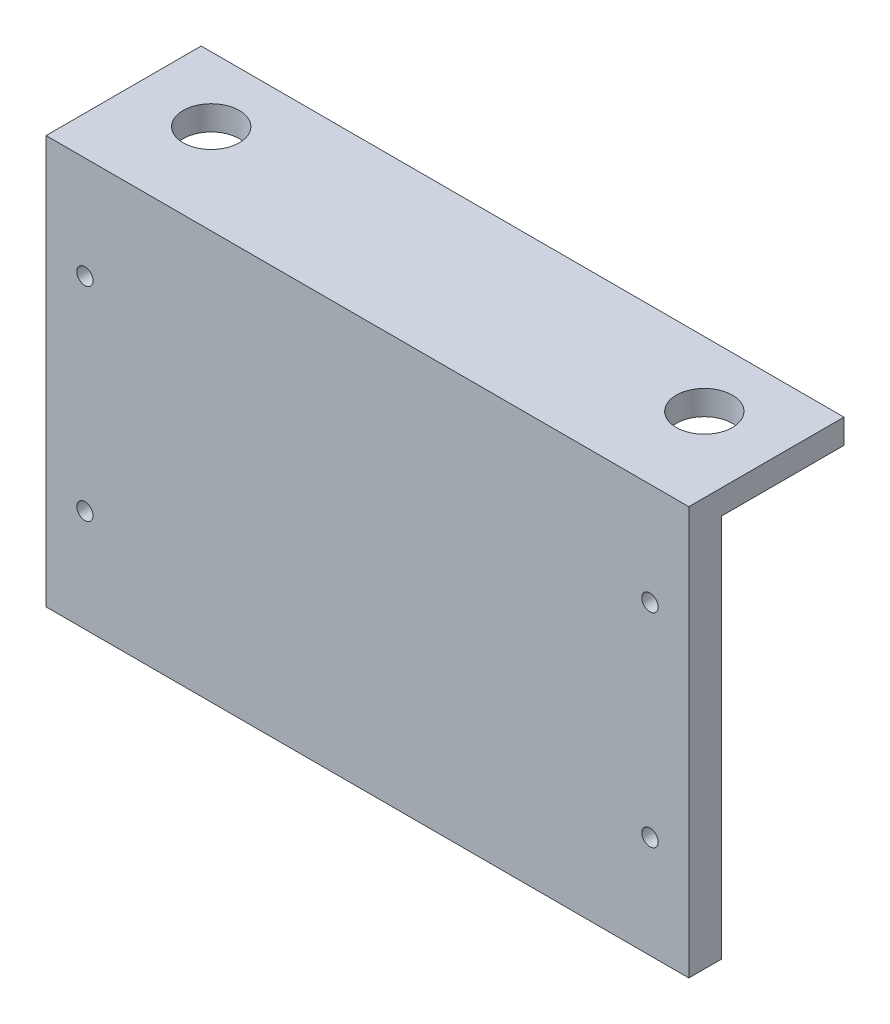
ISO-10303-21;
HEADER;
FILE_DESCRIPTION(('STEP AP214'),'2;1');
FILE_NAME('part.step','',(''),(''),'','','');
FILE_SCHEMA(('AUTOMOTIVE_DESIGN { 1 0 10303 214 1 1 1 1 }'));
ENDSEC;
DATA;
#1=APPLICATION_CONTEXT('core data for automotive mechanical design processes');
#2=APPLICATION_PROTOCOL_DEFINITION('international standard','automotive_design',2000,#1);
#3=PRODUCT_CONTEXT('',#1,'mechanical');
#4=PRODUCT('Part','Part','',(#3));
#5=PRODUCT_RELATED_PRODUCT_CATEGORY('part','',(#4));
#6=PRODUCT_DEFINITION_FORMATION('','',#4);
#7=PRODUCT_DEFINITION_CONTEXT('part definition',#1,'design');
#8=PRODUCT_DEFINITION('design','',#6,#7);
#9=PRODUCT_DEFINITION_SHAPE('','',#8);
#10=(LENGTH_UNIT() NAMED_UNIT(*) SI_UNIT(.MILLI.,.METRE.));
#11=(NAMED_UNIT(*) PLANE_ANGLE_UNIT() SI_UNIT($,.RADIAN.));
#12=(NAMED_UNIT(*) SI_UNIT($,.STERADIAN.) SOLID_ANGLE_UNIT());
#13=UNCERTAINTY_MEASURE_WITH_UNIT(LENGTH_MEASURE(1.E-05),#10,'distance_accuracy_value','');
#14=(GEOMETRIC_REPRESENTATION_CONTEXT(3) GLOBAL_UNCERTAINTY_ASSIGNED_CONTEXT((#13)) GLOBAL_UNIT_ASSIGNED_CONTEXT((#10,
#11,#12)) REPRESENTATION_CONTEXT('',''));
#15=CARTESIAN_POINT('',(0.,0.,0.));
#16=DIRECTION('',(0.,0.,1.));
#17=DIRECTION('',(1.,0.,0.));
#18=AXIS2_PLACEMENT_3D('',#15,#16,#17);
#19=CARTESIAN_POINT('',(0.,0.,0.));
#20=DIRECTION('',(0.,0.,1.));
#21=DIRECTION('',(1.,0.,0.));
#22=AXIS2_PLACEMENT_3D('',#19,#20,#21);
#23=PLANE('',#22);
#24=CARTESIAN_POINT('',(-43.9547,-15.82674,0.));
#25=DIRECTION('',(0.,0.,1.));
#26=DIRECTION('',(1.,0.,0.));
#27=AXIS2_PLACEMENT_3D('',#24,#25,#26);
#28=CIRCLE('',#27,1.27);
#29=CARTESIAN_POINT('',(-42.6847,-15.82674,0.));
#30=VERTEX_POINT('',#29);
#31=EDGE_CURVE('E304',#30,#30,#28,.F.);
#32=ORIENTED_EDGE('',*,*,#31,.F.);
#33=EDGE_LOOP('',(#32));
#34=FACE_BOUND('',#33,.T.);
#35=DIRECTION('',(-1.,0.,0.));
#36=VECTOR('',#35,1.);
#37=CARTESIAN_POINT('',(50.,27.94,0.));
#38=LINE('',#37,#36);
#39=CARTESIAN_POINT('',(50.,27.94,0.));
#40=VERTEX_POINT('',#39);
#41=CARTESIAN_POINT('',(-50.,27.94,0.));
#42=VERTEX_POINT('',#41);
#43=EDGE_CURVE('E52',#40,#42,#38,.T.);
#44=ORIENTED_EDGE('',*,*,#43,.F.);
#45=DIRECTION('',(0.,-1.,0.));
#46=VECTOR('',#45,1.);
#47=CARTESIAN_POINT('',(50.,31.75,0.));
#48=LINE('',#47,#46);
#49=CARTESIAN_POINT('',(50.,-31.75,0.));
#50=VERTEX_POINT('',#49);
#51=EDGE_CURVE('E74',#40,#50,#48,.T.);
#52=ORIENTED_EDGE('',*,*,#51,.T.);
#53=DIRECTION('',(1.,0.,0.));
#54=VECTOR('',#53,1.);
#55=CARTESIAN_POINT('',(-50.,-31.75,0.));
#56=LINE('',#55,#54);
#57=CARTESIAN_POINT('',(-50.,-31.75,0.));
#58=VERTEX_POINT('',#57);
#59=EDGE_CURVE('E120',#58,#50,#56,.T.);
#60=ORIENTED_EDGE('',*,*,#59,.F.);
#61=DIRECTION('',(0.,-1.,0.));
#62=VECTOR('',#61,1.);
#63=CARTESIAN_POINT('',(-50.,31.75,0.));
#64=LINE('',#63,#62);
#65=EDGE_CURVE('E118',#42,#58,#64,.T.);
#66=ORIENTED_EDGE('',*,*,#65,.F.);
#67=EDGE_LOOP('',(#44,#52,#60,#66));
#68=FACE_BOUND('',#67,.T.);
#69=CARTESIAN_POINT('',(43.9547,-15.82674,0.));
#70=DIRECTION('',(0.,0.,1.));
#71=DIRECTION('',(1.,0.,0.));
#72=AXIS2_PLACEMENT_3D('',#69,#70,#71);
#73=CIRCLE('',#72,1.27);
#74=CARTESIAN_POINT('',(45.2247,-15.82674,0.));
#75=VERTEX_POINT('',#74);
#76=EDGE_CURVE('E309',#75,#75,#73,.T.);
#77=ORIENTED_EDGE('',*,*,#76,.T.);
#78=EDGE_LOOP('',(#77));
#79=FACE_BOUND('',#78,.T.);
#80=CARTESIAN_POINT('',(43.9547,15.82674,0.));
#81=DIRECTION('',(0.,0.,1.));
#82=DIRECTION('',(1.,0.,0.));
#83=AXIS2_PLACEMENT_3D('',#80,#81,#82);
#84=CIRCLE('',#83,1.27);
#85=CARTESIAN_POINT('',(45.2247,15.82674,0.));
#86=VERTEX_POINT('',#85);
#87=EDGE_CURVE('E312',#86,#86,#84,.F.);
#88=ORIENTED_EDGE('',*,*,#87,.F.);
#89=EDGE_LOOP('',(#88));
#90=FACE_BOUND('',#89,.T.);
#91=CARTESIAN_POINT('',(-43.9547,15.82674,0.));
#92=DIRECTION('',(0.,0.,1.));
#93=DIRECTION('',(1.,0.,0.));
#94=AXIS2_PLACEMENT_3D('',#91,#92,#93);
#95=CIRCLE('',#94,1.27);
#96=CARTESIAN_POINT('',(-42.6847,15.82674,0.));
#97=VERTEX_POINT('',#96);
#98=EDGE_CURVE('E306',#97,#97,#95,.T.);
#99=ORIENTED_EDGE('',*,*,#98,.T.);
#100=EDGE_LOOP('',(#99));
#101=FACE_BOUND('',#100,.T.);
#102=ADVANCED_FACE('F35',(#34,#68,#79,#90,#101),#23,.F.);
#103=CARTESIAN_POINT('',(0.,0.,5.08));
#104=DIRECTION('',(0.,0.,1.));
#105=DIRECTION('',(1.,0.,0.));
#106=AXIS2_PLACEMENT_3D('',#103,#104,#105);
#107=PLANE('',#106);
#108=CARTESIAN_POINT('',(-43.9547,-15.82674,5.08));
#109=DIRECTION('',(0.,0.,-1.));
#110=DIRECTION('',(-1.,0.,0.));
#111=AXIS2_PLACEMENT_3D('',#108,#109,#110);
#112=CIRCLE('',#111,1.27);
#113=CARTESIAN_POINT('',(-45.2247,-15.82674,5.08));
#114=VERTEX_POINT('',#113);
#115=EDGE_CURVE('E302',#114,#114,#112,.T.);
#116=ORIENTED_EDGE('',*,*,#115,.T.);
#117=EDGE_LOOP('',(#116));
#118=FACE_BOUND('',#117,.T.);
#119=CARTESIAN_POINT('',(43.9547,15.82674,5.08));
#120=DIRECTION('',(0.,0.,-1.));
#121=DIRECTION('',(-1.,0.,0.));
#122=AXIS2_PLACEMENT_3D('',#119,#120,#121);
#123=CIRCLE('',#122,1.27);
#124=CARTESIAN_POINT('',(42.6847,15.82674,5.08));
#125=VERTEX_POINT('',#124);
#126=EDGE_CURVE('E333',#125,#125,#123,.T.);
#127=ORIENTED_EDGE('',*,*,#126,.T.);
#128=EDGE_LOOP('',(#127));
#129=FACE_BOUND('',#128,.T.);
#130=CARTESIAN_POINT('',(43.9547,-15.82674,5.08));
#131=DIRECTION('',(0.,0.,1.));
#132=DIRECTION('',(1.,0.,0.));
#133=AXIS2_PLACEMENT_3D('',#130,#131,#132);
#134=CIRCLE('',#133,1.27);
#135=CARTESIAN_POINT('',(45.2247,-15.82674,5.08));
#136=VERTEX_POINT('',#135);
#137=EDGE_CURVE('E305',#136,#136,#134,.T.);
#138=ORIENTED_EDGE('',*,*,#137,.F.);
#139=EDGE_LOOP('',(#138));
#140=FACE_BOUND('',#139,.T.);
#141=DIRECTION('',(0.,-1.,0.));
#142=VECTOR('',#141,1.);
#143=CARTESIAN_POINT('',(-50.,31.75,5.08));
#144=LINE('',#143,#142);
#145=CARTESIAN_POINT('',(-50.,31.75,5.08));
#146=VERTEX_POINT('',#145);
#147=CARTESIAN_POINT('',(-50.,-31.75,5.08));
#148=VERTEX_POINT('',#147);
#149=EDGE_CURVE('E125',#146,#148,#144,.T.);
#150=ORIENTED_EDGE('',*,*,#149,.T.);
#151=DIRECTION('',(1.,0.,0.));
#152=VECTOR('',#151,1.);
#153=CARTESIAN_POINT('',(-50.,-31.75,5.08));
#154=LINE('',#153,#152);
#155=CARTESIAN_POINT('',(50.,-31.75,5.08));
#156=VERTEX_POINT('',#155);
#157=EDGE_CURVE('E81',#148,#156,#154,.T.);
#158=ORIENTED_EDGE('',*,*,#157,.T.);
#159=DIRECTION('',(0.,-1.,0.));
#160=VECTOR('',#159,1.);
#161=CARTESIAN_POINT('',(50.,31.75,5.08));
#162=LINE('',#161,#160);
#163=CARTESIAN_POINT('',(50.,31.75,5.08));
#164=VERTEX_POINT('',#163);
#165=EDGE_CURVE('E128',#164,#156,#162,.T.);
#166=ORIENTED_EDGE('',*,*,#165,.F.);
#167=DIRECTION('',(1.,0.,0.));
#168=VECTOR('',#167,1.);
#169=CARTESIAN_POINT('',(-50.,31.75,5.08));
#170=LINE('',#169,#168);
#171=EDGE_CURVE('E131',#146,#164,#170,.T.);
#172=ORIENTED_EDGE('',*,*,#171,.F.);
#173=EDGE_LOOP('',(#150,#158,#166,#172));
#174=FACE_BOUND('',#173,.T.);
#175=CARTESIAN_POINT('',(-43.9547,15.82674,5.08));
#176=DIRECTION('',(0.,0.,1.));
#177=DIRECTION('',(1.,0.,0.));
#178=AXIS2_PLACEMENT_3D('',#175,#176,#177);
#179=CIRCLE('',#178,1.27);
#180=CARTESIAN_POINT('',(-42.6847,15.82674,5.08));
#181=VERTEX_POINT('',#180);
#182=EDGE_CURVE('E330',#181,#181,#179,.T.);
#183=ORIENTED_EDGE('',*,*,#182,.F.);
#184=EDGE_LOOP('',(#183));
#185=FACE_BOUND('',#184,.T.);
#186=ADVANCED_FACE('F159',(#118,#129,#140,#174,#185),#107,.T.);
#187=CARTESIAN_POINT('',(-50.,31.75,5.08));
#188=DIRECTION('',(1.,0.,0.));
#189=DIRECTION('',(0.,1.,0.));
#190=AXIS2_PLACEMENT_3D('',#187,#188,#189);
#191=PLANE('',#190);
#192=DIRECTION('',(0.,0.,-1.));
#193=VECTOR('',#192,1.);
#194=CARTESIAN_POINT('',(-50.,31.75,5.08));
#195=LINE('',#194,#193);
#196=CARTESIAN_POINT('',(-50.,31.75,-19.05));
#197=VERTEX_POINT('',#196);
#198=EDGE_CURVE('E61',#146,#197,#195,.T.);
#199=ORIENTED_EDGE('',*,*,#198,.T.);
#200=DIRECTION('',(0.,1.,0.));
#201=VECTOR('',#200,1.);
#202=CARTESIAN_POINT('',(-50.,31.75,-19.05));
#203=LINE('',#202,#201);
#204=CARTESIAN_POINT('',(-50.,27.94,-19.05));
#205=VERTEX_POINT('',#204);
#206=EDGE_CURVE('E108',#205,#197,#203,.T.);
#207=ORIENTED_EDGE('',*,*,#206,.F.);
#208=DIRECTION('',(0.,0.,1.));
#209=VECTOR('',#208,1.);
#210=CARTESIAN_POINT('',(-50.,27.94,-19.05));
#211=LINE('',#210,#209);
#212=EDGE_CURVE('E104',#205,#42,#211,.T.);
#213=ORIENTED_EDGE('',*,*,#212,.T.);
#214=ORIENTED_EDGE('',*,*,#65,.T.);
#215=DIRECTION('',(0.,0.,-1.));
#216=VECTOR('',#215,1.);
#217=CARTESIAN_POINT('',(-50.,-31.75,5.08));
#218=LINE('',#217,#216);
#219=EDGE_CURVE('E11',#148,#58,#218,.T.);
#220=ORIENTED_EDGE('',*,*,#219,.F.);
#221=ORIENTED_EDGE('',*,*,#149,.F.);
#222=EDGE_LOOP('',(#199,#207,#213,#214,#220,#221));
#223=FACE_BOUND('',#222,.T.);
#224=ADVANCED_FACE('F37',(#223),#191,.F.);
#225=CARTESIAN_POINT('',(-50.,-31.75,5.08));
#226=DIRECTION('',(0.,1.,0.));
#227=DIRECTION('',(0.,0.,1.));
#228=AXIS2_PLACEMENT_3D('',#225,#226,#227);
#229=PLANE('',#228);
#230=ORIENTED_EDGE('',*,*,#59,.T.);
#231=DIRECTION('',(0.,0.,-1.));
#232=VECTOR('',#231,1.);
#233=CARTESIAN_POINT('',(50.,-31.75,5.08));
#234=LINE('',#233,#232);
#235=EDGE_CURVE('E44',#156,#50,#234,.T.);
#236=ORIENTED_EDGE('',*,*,#235,.F.);
#237=ORIENTED_EDGE('',*,*,#157,.F.);
#238=ORIENTED_EDGE('',*,*,#219,.T.);
#239=EDGE_LOOP('',(#230,#236,#237,#238));
#240=FACE_BOUND('',#239,.T.);
#241=ADVANCED_FACE('F162',(#240),#229,.F.);
#242=CARTESIAN_POINT('',(50.,31.75,5.08));
#243=DIRECTION('',(1.,0.,0.));
#244=DIRECTION('',(0.,1.,0.));
#245=AXIS2_PLACEMENT_3D('',#242,#243,#244);
#246=PLANE('',#245);
#247=ORIENTED_EDGE('',*,*,#51,.F.);
#248=DIRECTION('',(0.,0.,1.));
#249=VECTOR('',#248,1.);
#250=CARTESIAN_POINT('',(50.,27.94,-19.05));
#251=LINE('',#250,#249);
#252=CARTESIAN_POINT('',(50.,27.94,-19.05));
#253=VERTEX_POINT('',#252);
#254=EDGE_CURVE('E102',#253,#40,#251,.T.);
#255=ORIENTED_EDGE('',*,*,#254,.F.);
#256=DIRECTION('',(0.,-1.,0.));
#257=VECTOR('',#256,1.);
#258=CARTESIAN_POINT('',(50.,31.75,-19.05));
#259=LINE('',#258,#257);
#260=CARTESIAN_POINT('',(50.,31.75,-19.05));
#261=VERTEX_POINT('',#260);
#262=EDGE_CURVE('E109',#261,#253,#259,.T.);
#263=ORIENTED_EDGE('',*,*,#262,.F.);
#264=DIRECTION('',(0.,0.,-1.));
#265=VECTOR('',#264,1.);
#266=CARTESIAN_POINT('',(50.,31.75,5.08));
#267=LINE('',#266,#265);
#268=EDGE_CURVE('E137',#164,#261,#267,.T.);
#269=ORIENTED_EDGE('',*,*,#268,.F.);
#270=ORIENTED_EDGE('',*,*,#165,.T.);
#271=ORIENTED_EDGE('',*,*,#235,.T.);
#272=EDGE_LOOP('',(#247,#255,#263,#269,#270,#271));
#273=FACE_BOUND('',#272,.T.);
#274=ADVANCED_FACE('F117',(#273),#246,.T.);
#275=CARTESIAN_POINT('',(-50.,31.75,5.08));
#276=DIRECTION('',(0.,1.,0.));
#277=DIRECTION('',(0.,0.,1.));
#278=AXIS2_PLACEMENT_3D('',#275,#276,#277);
#279=PLANE('',#278);
#280=CARTESIAN_POINT('',(38.3575886498022,31.75,-8.97309283142178));
#281=DIRECTION('',(0.,-1.,0.));
#282=DIRECTION('',(0.,0.,-1.));
#283=AXIS2_PLACEMENT_3D('',#280,#281,#282);
#284=CIRCLE('',#283,4.36493691685829);
#285=CARTESIAN_POINT('',(38.3575886498022,31.75,-13.3380297482801));
#286=VERTEX_POINT('',#285);
#287=EDGE_CURVE('E149',#286,#286,#284,.T.);
#288=ORIENTED_EDGE('',*,*,#287,.T.);
#289=EDGE_LOOP('',(#288));
#290=FACE_BOUND('',#289,.T.);
#291=CARTESIAN_POINT('',(-38.3575886498022,31.75,-8.97309283142178));
#292=DIRECTION('',(0.,1.,0.));
#293=DIRECTION('',(0.,0.,1.));
#294=AXIS2_PLACEMENT_3D('',#291,#292,#293);
#295=CIRCLE('',#294,4.36493691685829);
#296=CARTESIAN_POINT('',(-38.3575886498022,31.75,-4.60815591456349));
#297=VERTEX_POINT('',#296);
#298=EDGE_CURVE('E141',#297,#297,#295,.T.);
#299=ORIENTED_EDGE('',*,*,#298,.F.);
#300=EDGE_LOOP('',(#299));
#301=FACE_BOUND('',#300,.T.);
#302=ORIENTED_EDGE('',*,*,#268,.T.);
#303=DIRECTION('',(1.,0.,0.));
#304=VECTOR('',#303,1.);
#305=CARTESIAN_POINT('',(50.,31.75,-19.05));
#306=LINE('',#305,#304);
#307=EDGE_CURVE('E114',#197,#261,#306,.T.);
#308=ORIENTED_EDGE('',*,*,#307,.F.);
#309=ORIENTED_EDGE('',*,*,#198,.F.);
#310=ORIENTED_EDGE('',*,*,#171,.T.);
#311=EDGE_LOOP('',(#302,#308,#309,#310));
#312=FACE_BOUND('',#311,.T.);
#313=ADVANCED_FACE('F155',(#290,#301,#312),#279,.T.);
#314=CARTESIAN_POINT('',(50.,27.94,-19.05));
#315=DIRECTION('',(0.,1.,0.));
#316=DIRECTION('',(0.,0.,1.));
#317=AXIS2_PLACEMENT_3D('',#314,#315,#316);
#318=PLANE('',#317);
#319=CARTESIAN_POINT('',(38.3575886498022,27.94,-8.97309283142178));
#320=DIRECTION('',(0.,1.,0.));
#321=DIRECTION('',(0.,0.,1.));
#322=AXIS2_PLACEMENT_3D('',#319,#320,#321);
#323=CIRCLE('',#322,4.36493691685829);
#324=CARTESIAN_POINT('',(38.3575886498022,27.94,-4.60815591456349));
#325=VERTEX_POINT('',#324);
#326=EDGE_CURVE('E39',#325,#325,#323,.F.);
#327=ORIENTED_EDGE('',*,*,#326,.F.);
#328=EDGE_LOOP('',(#327));
#329=FACE_BOUND('',#328,.T.);
#330=CARTESIAN_POINT('',(-38.3575886498022,27.94,-8.97309283142178));
#331=DIRECTION('',(0.,1.,0.));
#332=DIRECTION('',(0.,0.,1.));
#333=AXIS2_PLACEMENT_3D('',#330,#331,#332);
#334=CIRCLE('',#333,4.36493691685829);
#335=CARTESIAN_POINT('',(-38.3575886498022,27.94,-4.60815591456349));
#336=VERTEX_POINT('',#335);
#337=EDGE_CURVE('E139',#336,#336,#334,.T.);
#338=ORIENTED_EDGE('',*,*,#337,.T.);
#339=EDGE_LOOP('',(#338));
#340=FACE_BOUND('',#339,.T.);
#341=ORIENTED_EDGE('',*,*,#43,.T.);
#342=ORIENTED_EDGE('',*,*,#212,.F.);
#343=DIRECTION('',(-1.,0.,0.));
#344=VECTOR('',#343,1.);
#345=CARTESIAN_POINT('',(50.,27.94,-19.05));
#346=LINE('',#345,#344);
#347=EDGE_CURVE('E98',#253,#205,#346,.T.);
#348=ORIENTED_EDGE('',*,*,#347,.F.);
#349=ORIENTED_EDGE('',*,*,#254,.T.);
#350=EDGE_LOOP('',(#341,#342,#348,#349));
#351=FACE_BOUND('',#350,.T.);
#352=ADVANCED_FACE('F100',(#329,#340,#351),#318,.F.);
#353=CARTESIAN_POINT('',(0.,0.,-19.05));
#354=DIRECTION('',(0.,0.,-1.));
#355=DIRECTION('',(-1.,0.,0.));
#356=AXIS2_PLACEMENT_3D('',#353,#354,#355);
#357=PLANE('',#356);
#358=ORIENTED_EDGE('',*,*,#262,.T.);
#359=ORIENTED_EDGE('',*,*,#347,.T.);
#360=ORIENTED_EDGE('',*,*,#206,.T.);
#361=ORIENTED_EDGE('',*,*,#307,.T.);
#362=EDGE_LOOP('',(#358,#359,#360,#361));
#363=FACE_BOUND('',#362,.T.);
#364=ADVANCED_FACE('F113',(#363),#357,.T.);
#365=CARTESIAN_POINT('',(-38.3575886498022,-31.75,-8.97309283142178));
#366=DIRECTION('',(0.,1.,0.));
#367=DIRECTION('',(0.,0.,1.));
#368=AXIS2_PLACEMENT_3D('',#365,#366,#367);
#369=CYLINDRICAL_SURFACE('',#368,4.36493691685829);
#370=ORIENTED_EDGE('',*,*,#298,.T.);
#371=EDGE_LOOP('',(#370));
#372=FACE_BOUND('',#371,.T.);
#373=ORIENTED_EDGE('',*,*,#337,.F.);
#374=EDGE_LOOP('',(#373));
#375=FACE_BOUND('',#374,.T.);
#376=ADVANCED_FACE('F204',(#372,#375),#369,.F.);
#377=CARTESIAN_POINT('',(38.3575886498022,-31.75,-8.97309283142178));
#378=DIRECTION('',(0.,1.,0.));
#379=DIRECTION('',(0.,0.,1.));
#380=AXIS2_PLACEMENT_3D('',#377,#378,#379);
#381=CYLINDRICAL_SURFACE('',#380,4.36493691685829);
#382=ORIENTED_EDGE('',*,*,#287,.F.);
#383=EDGE_LOOP('',(#382));
#384=FACE_BOUND('',#383,.T.);
#385=ORIENTED_EDGE('',*,*,#326,.T.);
#386=EDGE_LOOP('',(#385));
#387=FACE_BOUND('',#386,.T.);
#388=ADVANCED_FACE('F210',(#384,#387),#381,.F.);
#389=CARTESIAN_POINT('',(43.9547,-15.82674,-19.05));
#390=DIRECTION('',(0.,0.,1.));
#391=DIRECTION('',(1.,0.,0.));
#392=AXIS2_PLACEMENT_3D('',#389,#390,#391);
#393=CYLINDRICAL_SURFACE('',#392,1.27);
#394=ORIENTED_EDGE('',*,*,#137,.T.);
#395=EDGE_LOOP('',(#394));
#396=FACE_BOUND('',#395,.T.);
#397=ORIENTED_EDGE('',*,*,#76,.F.);
#398=EDGE_LOOP('',(#397));
#399=FACE_BOUND('',#398,.T.);
#400=ADVANCED_FACE('F217',(#396,#399),#393,.F.);
#401=CARTESIAN_POINT('',(43.9547,15.82674,-19.05));
#402=DIRECTION('',(0.,0.,1.));
#403=DIRECTION('',(1.,0.,0.));
#404=AXIS2_PLACEMENT_3D('',#401,#402,#403);
#405=CYLINDRICAL_SURFACE('',#404,1.27);
#406=ORIENTED_EDGE('',*,*,#126,.F.);
#407=EDGE_LOOP('',(#406));
#408=FACE_BOUND('',#407,.T.);
#409=ORIENTED_EDGE('',*,*,#87,.T.);
#410=EDGE_LOOP('',(#409));
#411=FACE_BOUND('',#410,.T.);
#412=ADVANCED_FACE('F225',(#408,#411),#405,.F.);
#413=CARTESIAN_POINT('',(-43.9547,15.82674,-19.05));
#414=DIRECTION('',(0.,0.,1.));
#415=DIRECTION('',(1.,0.,0.));
#416=AXIS2_PLACEMENT_3D('',#413,#414,#415);
#417=CYLINDRICAL_SURFACE('',#416,1.27);
#418=ORIENTED_EDGE('',*,*,#182,.T.);
#419=EDGE_LOOP('',(#418));
#420=FACE_BOUND('',#419,.T.);
#421=ORIENTED_EDGE('',*,*,#98,.F.);
#422=EDGE_LOOP('',(#421));
#423=FACE_BOUND('',#422,.T.);
#424=ADVANCED_FACE('F234',(#420,#423),#417,.F.);
#425=CARTESIAN_POINT('',(-43.9547,-15.82674,-19.05));
#426=DIRECTION('',(0.,0.,1.));
#427=DIRECTION('',(1.,0.,0.));
#428=AXIS2_PLACEMENT_3D('',#425,#426,#427);
#429=CYLINDRICAL_SURFACE('',#428,1.27);
#430=ORIENTED_EDGE('',*,*,#115,.F.);
#431=EDGE_LOOP('',(#430));
#432=FACE_BOUND('',#431,.T.);
#433=ORIENTED_EDGE('',*,*,#31,.T.);
#434=EDGE_LOOP('',(#433));
#435=FACE_BOUND('',#434,.T.);
#436=ADVANCED_FACE('F242',(#432,#435),#429,.F.);
#437=CLOSED_SHELL('',(#102,#186,#224,#241,#274,#313,#352,#364,#376,#388,#400,#412,#424,#436));
#438=MANIFOLD_SOLID_BREP('B2',#437);
#439=ADVANCED_BREP_SHAPE_REPRESENTATION('',(#18,#438),#14);
#440=SHAPE_DEFINITION_REPRESENTATION(#9,#439);
ENDSEC;
END-ISO-10303-21;
